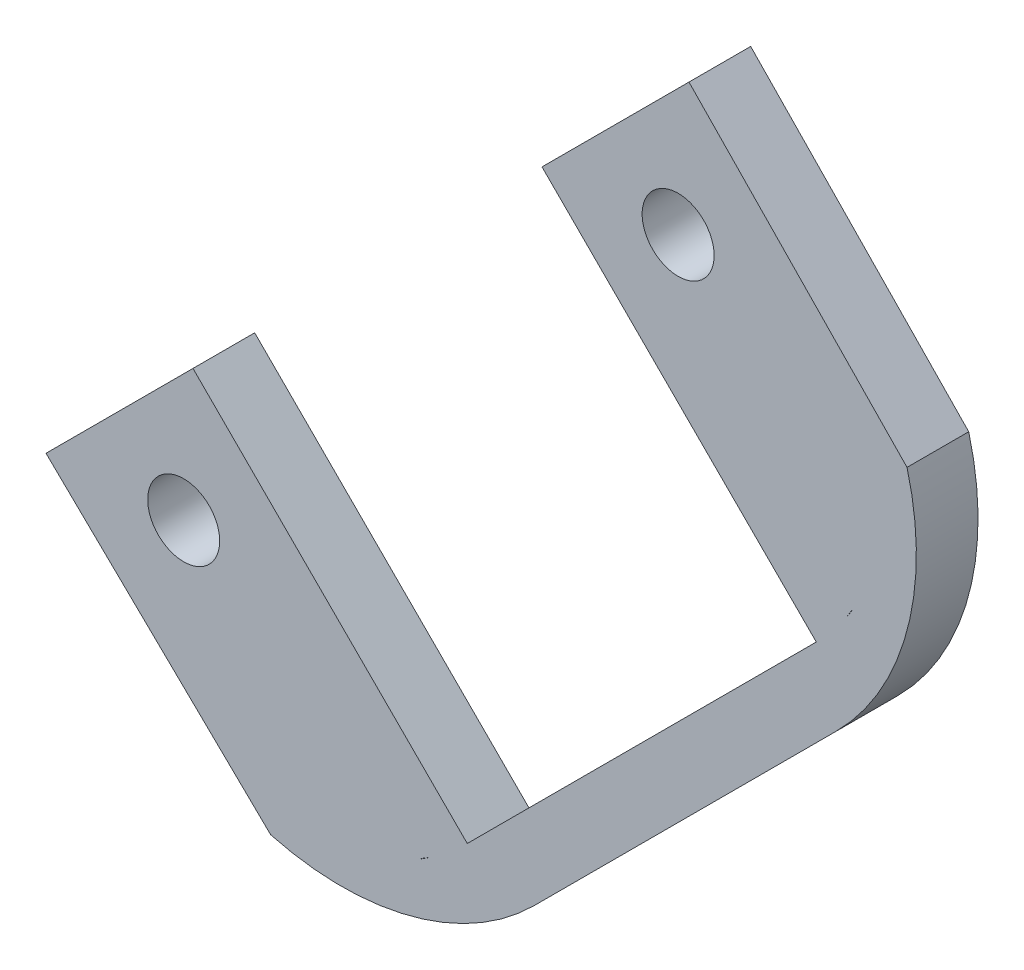
ISO-10303-21;
HEADER;
FILE_DESCRIPTION(('STEP AP214'),'2;1');
FILE_NAME('part.step','',(''),(''),'','','');
FILE_SCHEMA(('AUTOMOTIVE_DESIGN { 1 0 10303 214 1 1 1 1 }'));
ENDSEC;
DATA;
#1=APPLICATION_CONTEXT('core data for automotive mechanical design processes');
#2=APPLICATION_PROTOCOL_DEFINITION('international standard','automotive_design',2000,#1);
#3=PRODUCT_CONTEXT('',#1,'mechanical');
#4=PRODUCT('Part','Part','',(#3));
#5=PRODUCT_RELATED_PRODUCT_CATEGORY('part','',(#4));
#6=PRODUCT_DEFINITION_FORMATION('','',#4);
#7=PRODUCT_DEFINITION_CONTEXT('part definition',#1,'design');
#8=PRODUCT_DEFINITION('design','',#6,#7);
#9=PRODUCT_DEFINITION_SHAPE('','',#8);
#10=(LENGTH_UNIT() NAMED_UNIT(*) SI_UNIT(.MILLI.,.METRE.));
#11=(NAMED_UNIT(*) PLANE_ANGLE_UNIT() SI_UNIT($,.RADIAN.));
#12=(NAMED_UNIT(*) SI_UNIT($,.STERADIAN.) SOLID_ANGLE_UNIT());
#13=UNCERTAINTY_MEASURE_WITH_UNIT(LENGTH_MEASURE(1.E-05),#10,'distance_accuracy_value','');
#14=(GEOMETRIC_REPRESENTATION_CONTEXT(3) GLOBAL_UNCERTAINTY_ASSIGNED_CONTEXT((#13)) GLOBAL_UNIT_ASSIGNED_CONTEXT((#10,
#11,#12)) REPRESENTATION_CONTEXT('',''));
#15=CARTESIAN_POINT('',(0.,0.,0.));
#16=DIRECTION('',(0.,0.,1.));
#17=DIRECTION('',(1.,0.,0.));
#18=AXIS2_PLACEMENT_3D('',#15,#16,#17);
#19=CARTESIAN_POINT('',(8.48528137423825,8.48528137423825,3.));
#20=DIRECTION('',(-0.707106781186547,-0.707106781186548,0.));
#21=DIRECTION('',(0.707106781186548,-0.707106781186547,0.));
#22=AXIS2_PLACEMENT_3D('',#19,#20,#21);
#23=PLANE('',#22);
#24=DIRECTION('',(-0.707106781186548,0.707106781186547,0.));
#25=VECTOR('',#24,1.);
#26=CARTESIAN_POINT('',(8.48528137423825,8.48528137423825,3.));
#27=LINE('',#26,#25);
#28=CARTESIAN_POINT('',(-44.5477272147514,61.5182899632279,3.));
#29=VERTEX_POINT('',#28);
#30=CARTESIAN_POINT('',(-57.8849131188985,74.855475867375,3.));
#31=VERTEX_POINT('',#30);
#32=EDGE_CURVE('E226',#29,#31,#27,.T.);
#33=ORIENTED_EDGE('',*,*,#32,.T.);
#34=DIRECTION('',(0.,0.,-1.));
#35=VECTOR('',#34,1.);
#36=CARTESIAN_POINT('',(-57.8849131188985,74.855475867375,3.));
#37=LINE('',#36,#35);
#38=CARTESIAN_POINT('',(-57.8849131188985,74.855475867375,0.));
#39=VERTEX_POINT('',#38);
#40=EDGE_CURVE('E204',#31,#39,#37,.T.);
#41=ORIENTED_EDGE('',*,*,#40,.T.);
#42=DIRECTION('',(-0.707106781186548,0.707106781186547,0.));
#43=VECTOR('',#42,1.);
#44=CARTESIAN_POINT('',(8.48528137423825,8.48528137423825,0.));
#45=LINE('',#44,#43);
#46=CARTESIAN_POINT('',(-44.5477272147514,61.5182899632279,0.));
#47=VERTEX_POINT('',#46);
#48=EDGE_CURVE('E259',#47,#39,#45,.T.);
#49=ORIENTED_EDGE('',*,*,#48,.F.);
#50=DIRECTION('',(0.,0.,-1.));
#51=VECTOR('',#50,1.);
#52=CARTESIAN_POINT('',(-44.5477272147514,61.5182899632279,3.));
#53=LINE('',#52,#51);
#54=EDGE_CURVE('E286',#29,#47,#53,.T.);
#55=ORIENTED_EDGE('',*,*,#54,.F.);
#56=EDGE_LOOP('',(#33,#41,#49,#55));
#57=FACE_BOUND('',#56,.T.);
#58=ADVANCED_FACE('F77',(#57),#23,.T.);
#59=CARTESIAN_POINT('',(-67.6375507112246,52.9508824085547,3.));
#60=DIRECTION('',(0.,0.,-1.));
#61=DIRECTION('',(-1.,0.,0.));
#62=AXIS2_PLACEMENT_3D('',#59,#60,#61);
#63=CYLINDRICAL_SURFACE('',#62,13.2688987916568);
#64=CARTESIAN_POINT('',(-67.6375507112246,52.9508824085547,3.));
#65=DIRECTION('',(0.,0.,1.));
#66=DIRECTION('',(1.,0.,0.));
#67=AXIS2_PLACEMENT_3D('',#64,#65,#66);
#68=CIRCLE('',#67,13.2688987916568);
#69=CARTESIAN_POINT('',(-58.2550223967661,43.5683540940962,3.));
#70=VERTEX_POINT('',#69);
#71=CARTESIAN_POINT('',(-71.0779259033398,40.1357548758023,3.));
#72=VERTEX_POINT('',#71);
#73=EDGE_CURVE('E234',#70,#72,#68,.F.);
#74=ORIENTED_EDGE('',*,*,#73,.T.);
#75=DIRECTION('',(0.,0.,1.));
#76=VECTOR('',#75,1.);
#77=CARTESIAN_POINT('',(-71.0779259033398,40.1357548758023,0.));
#78=LINE('',#77,#76);
#79=CARTESIAN_POINT('',(-71.0779259033398,40.1357548758023,0.));
#80=VERTEX_POINT('',#79);
#81=EDGE_CURVE('E197',#80,#72,#78,.T.);
#82=ORIENTED_EDGE('',*,*,#81,.F.);
#83=CARTESIAN_POINT('',(-67.6375507112246,52.9508824085547,0.));
#84=DIRECTION('',(0.,0.,1.));
#85=DIRECTION('',(1.,0.,0.));
#86=AXIS2_PLACEMENT_3D('',#83,#84,#85);
#87=CIRCLE('',#86,13.2688987916568);
#88=CARTESIAN_POINT('',(-58.2550223967661,43.5683540940962,0.));
#89=VERTEX_POINT('',#88);
#90=EDGE_CURVE('E196',#89,#80,#87,.F.);
#91=ORIENTED_EDGE('',*,*,#90,.F.);
#92=DIRECTION('',(0.,0.,-1.));
#93=VECTOR('',#92,1.);
#94=CARTESIAN_POINT('',(-58.2550223967661,43.5683540940962,3.));
#95=LINE('',#94,#93);
#96=EDGE_CURVE('E281',#70,#89,#95,.T.);
#97=ORIENTED_EDGE('',*,*,#96,.F.);
#98=EDGE_LOOP('',(#74,#82,#91,#97));
#99=FACE_BOUND('',#98,.T.);
#100=ADVANCED_FACE('F324',(#99),#63,.T.);
#101=CARTESIAN_POINT('',(0.,0.,3.));
#102=DIRECTION('',(0.,0.,1.));
#103=DIRECTION('',(1.,0.,0.));
#104=AXIS2_PLACEMENT_3D('',#101,#102,#103);
#105=PLANE('',#104);
#106=CARTESIAN_POINT('',(-40.0316131143859,61.7917633764762,3.));
#107=DIRECTION('',(0.,0.,1.));
#108=DIRECTION('',(1.,0.,0.));
#109=AXIS2_PLACEMENT_3D('',#106,#107,#108);
#110=CIRCLE('',#109,3.38674980996248);
#111=CARTESIAN_POINT('',(-43.0211581293099,63.3832076510345,3.));
#112=VERTEX_POINT('',#111);
#113=CARTESIAN_POINT('',(-42.7452083028537,63.8182074118261,3.));
#114=VERTEX_POINT('',#113);
#115=EDGE_CURVE('E214',#112,#114,#110,.F.);
#116=ORIENTED_EDGE('',*,*,#115,.T.);
#117=CARTESIAN_POINT('',(-53.1310804698243,70.1016432183008,3.));
#118=DIRECTION('',(0.,0.,1.));
#119=DIRECTION('',(1.,0.,0.));
#120=AXIS2_PLACEMENT_3D('',#117,#118,#119);
#121=CIRCLE('',#120,12.1386945839634);
#122=EDGE_CURVE('E217',#114,#112,#121,.F.);
#123=ORIENTED_EDGE('',*,*,#122,.T.);
#124=EDGE_LOOP('',(#116,#123));
#125=FACE_BOUND('',#124,.T.);
#126=CARTESIAN_POINT('',(-61.7917633764768,40.0316131143856,3.));
#127=DIRECTION('',(0.,0.,1.));
#128=DIRECTION('',(1.,0.,0.));
#129=AXIS2_PLACEMENT_3D('',#126,#127,#128);
#130=CIRCLE('',#129,3.38674980996217);
#131=CARTESIAN_POINT('',(-63.3832076510358,43.0211581293087,3.));
#132=VERTEX_POINT('',#131);
#133=CARTESIAN_POINT('',(-63.8182074118257,42.7452083028537,3.));
#134=VERTEX_POINT('',#133);
#135=EDGE_CURVE('E237',#132,#134,#130,.T.);
#136=ORIENTED_EDGE('',*,*,#135,.F.);
#137=CARTESIAN_POINT('',(-70.1016432183015,53.1310804698237,3.));
#138=DIRECTION('',(0.,0.,1.));
#139=DIRECTION('',(1.,0.,0.));
#140=AXIS2_PLACEMENT_3D('',#137,#138,#139);
#141=CIRCLE('',#140,12.1386945839634);
#142=EDGE_CURVE('E240',#132,#134,#141,.F.);
#143=ORIENTED_EDGE('',*,*,#142,.T.);
#144=EDGE_LOOP('',(#136,#143));
#145=FACE_BOUND('',#144,.T.);
#146=CARTESIAN_POINT('',(-75.3068721963662,51.2652416360229,3.));
#147=DIRECTION('',(0.,0.,1.));
#148=DIRECTION('',(1.,0.,0.));
#149=AXIS2_PLACEMENT_3D('',#146,#147,#148);
#150=CIRCLE('',#149,1.75);
#151=CARTESIAN_POINT('',(-73.5568721963662,51.2652416360229,3.));
#152=VERTEX_POINT('',#151);
#153=EDGE_CURVE('E242',#152,#152,#150,.T.);
#154=ORIENTED_EDGE('',*,*,#153,.F.);
#155=EDGE_LOOP('',(#154));
#156=FACE_BOUND('',#155,.T.);
#157=CARTESIAN_POINT('',(-51.2652416360236,75.3068721963655,3.));
#158=DIRECTION('',(0.,0.,1.));
#159=DIRECTION('',(1.,0.,0.));
#160=AXIS2_PLACEMENT_3D('',#157,#158,#159);
#161=CIRCLE('',#160,1.75000000000379);
#162=CARTESIAN_POINT('',(-49.5152416360198,75.3068721963655,3.));
#163=VERTEX_POINT('',#162);
#164=EDGE_CURVE('E245',#163,#163,#161,.T.);
#165=ORIENTED_EDGE('',*,*,#164,.F.);
#166=EDGE_LOOP('',(#165));
#167=FACE_BOUND('',#166,.T.);
#168=DIRECTION('',(0.707106781186546,0.707106781186549,0.));
#169=VECTOR('',#168,1.);
#170=CARTESIAN_POINT('',(-66.3701944931369,66.3701944931367,3.));
#171=LINE('',#170,#169);
#172=CARTESIAN_POINT('',(-82.0021553932792,50.7382335929944,3.));
#173=VERTEX_POINT('',#172);
#174=CARTESIAN_POINT('',(-74.8554758673756,57.8849131188978,3.));
#175=VERTEX_POINT('',#174);
#176=EDGE_CURVE('E200',#173,#175,#171,.T.);
#177=ORIENTED_EDGE('',*,*,#176,.F.);
#178=DIRECTION('',(0.71759546167396,-0.696460159223007,0.));
#179=VECTOR('',#178,1.);
#180=CARTESIAN_POINT('',(-14.4179148792218,-14.8554517399439,3.));
#181=LINE('',#180,#179);
#182=EDGE_CURVE('E186',#173,#72,#181,.T.);
#183=ORIENTED_EDGE('',*,*,#182,.T.);
#184=ORIENTED_EDGE('',*,*,#73,.F.);
#185=DIRECTION('',(0.707106781186548,0.707106781186548,0.));
#186=VECTOR('',#185,1.);
#187=CARTESIAN_POINT('',(-50.9116882454312,50.9116882454312,3.));
#188=LINE('',#187,#186);
#189=CARTESIAN_POINT('',(-43.5683540940967,58.2550223967656,3.));
#190=VERTEX_POINT('',#189);
#191=EDGE_CURVE('E220',#70,#190,#188,.T.);
#192=ORIENTED_EDGE('',*,*,#191,.T.);
#193=CARTESIAN_POINT('',(-52.9508824085551,67.637550711224,3.));
#194=DIRECTION('',(0.,0.,1.));
#195=DIRECTION('',(1.,0.,0.));
#196=AXIS2_PLACEMENT_3D('',#193,#194,#195);
#197=CIRCLE('',#196,13.2688987916567);
#198=CARTESIAN_POINT('',(-40.1357548758028,71.077925903339,3.));
#199=VERTEX_POINT('',#198);
#200=EDGE_CURVE('E223',#190,#199,#197,.T.);
#201=ORIENTED_EDGE('',*,*,#200,.T.);
#202=DIRECTION('',(0.696460159223008,-0.717595461673959,0.));
#203=VECTOR('',#202,1.);
#204=CARTESIAN_POINT('',(14.8554517399433,14.4179148792213,3.));
#205=LINE('',#204,#203);
#206=CARTESIAN_POINT('',(-50.7382335929951,82.0021553932785,3.));
#207=VERTEX_POINT('',#206);
#208=EDGE_CURVE('E209',#207,#199,#205,.T.);
#209=ORIENTED_EDGE('',*,*,#208,.F.);
#210=DIRECTION('',(-0.707106781186548,-0.707106781186547,0.));
#211=VECTOR('',#210,1.);
#212=CARTESIAN_POINT('',(-66.3701944931367,66.3701944931368,3.));
#213=LINE('',#212,#211);
#214=EDGE_CURVE('E358',#207,#31,#213,.T.);
#215=ORIENTED_EDGE('',*,*,#214,.T.);
#216=ORIENTED_EDGE('',*,*,#32,.F.);
#217=DIRECTION('',(0.707106781186547,0.707106781186548,0.));
#218=VECTOR('',#217,1.);
#219=CARTESIAN_POINT('',(-53.0330085889896,53.0330085889896,3.));
#220=LINE('',#219,#218);
#221=CARTESIAN_POINT('',(-61.5182899632285,44.5477272147507,3.));
#222=VERTEX_POINT('',#221);
#223=EDGE_CURVE('E229',#222,#29,#220,.T.);
#224=ORIENTED_EDGE('',*,*,#223,.F.);
#225=DIRECTION('',(0.707106781186548,-0.707106781186548,0.));
#226=VECTOR('',#225,1.);
#227=CARTESIAN_POINT('',(-8.4852813742389,-8.4852813742389,3.));
#228=LINE('',#227,#226);
#229=EDGE_CURVE('E232',#175,#222,#228,.T.);
#230=ORIENTED_EDGE('',*,*,#229,.F.);
#231=EDGE_LOOP('',(#177,#183,#184,#192,#201,#209,#215,#216,#224,#230));
#232=FACE_BOUND('',#231,.T.);
#233=ADVANCED_FACE('F302',(#125,#145,#156,#167,#232),#105,.T.);
#234=CARTESIAN_POINT('',(0.,0.,0.));
#235=DIRECTION('',(0.,0.,1.));
#236=DIRECTION('',(1.,0.,0.));
#237=AXIS2_PLACEMENT_3D('',#234,#235,#236);
#238=PLANE('',#237);
#239=CARTESIAN_POINT('',(-40.0316131143859,61.7917633764762,0.));
#240=DIRECTION('',(0.,0.,1.));
#241=DIRECTION('',(1.,0.,0.));
#242=AXIS2_PLACEMENT_3D('',#239,#240,#241);
#243=CIRCLE('',#242,3.38674980996248);
#244=CARTESIAN_POINT('',(-43.0211581293099,63.3832076510345,0.));
#245=VERTEX_POINT('',#244);
#246=CARTESIAN_POINT('',(-42.7452083028537,63.8182074118261,0.));
#247=VERTEX_POINT('',#246);
#248=EDGE_CURVE('E213',#245,#247,#243,.F.);
#249=ORIENTED_EDGE('',*,*,#248,.F.);
#250=CARTESIAN_POINT('',(-53.1310804698243,70.1016432183008,0.));
#251=DIRECTION('',(0.,0.,1.));
#252=DIRECTION('',(1.,0.,0.));
#253=AXIS2_PLACEMENT_3D('',#250,#251,#252);
#254=CIRCLE('',#253,12.1386945839634);
#255=EDGE_CURVE('E251',#247,#245,#254,.F.);
#256=ORIENTED_EDGE('',*,*,#255,.F.);
#257=EDGE_LOOP('',(#249,#256));
#258=FACE_BOUND('',#257,.T.);
#259=CARTESIAN_POINT('',(-61.7917633764768,40.0316131143856,0.));
#260=DIRECTION('',(0.,0.,1.));
#261=DIRECTION('',(1.,0.,0.));
#262=AXIS2_PLACEMENT_3D('',#259,#260,#261);
#263=CIRCLE('',#262,3.38674980996217);
#264=CARTESIAN_POINT('',(-63.3832076510358,43.0211581293087,0.));
#265=VERTEX_POINT('',#264);
#266=CARTESIAN_POINT('',(-63.8182074118257,42.7452083028537,0.));
#267=VERTEX_POINT('',#266);
#268=EDGE_CURVE('E268',#265,#267,#263,.T.);
#269=ORIENTED_EDGE('',*,*,#268,.T.);
#270=CARTESIAN_POINT('',(-70.1016432183015,53.1310804698237,0.));
#271=DIRECTION('',(0.,0.,1.));
#272=DIRECTION('',(1.,0.,0.));
#273=AXIS2_PLACEMENT_3D('',#270,#271,#272);
#274=CIRCLE('',#273,12.1386945839634);
#275=EDGE_CURVE('E271',#265,#267,#274,.F.);
#276=ORIENTED_EDGE('',*,*,#275,.F.);
#277=EDGE_LOOP('',(#269,#276));
#278=FACE_BOUND('',#277,.T.);
#279=CARTESIAN_POINT('',(-75.3068721963662,51.2652416360229,0.));
#280=DIRECTION('',(0.,0.,1.));
#281=DIRECTION('',(1.,0.,0.));
#282=AXIS2_PLACEMENT_3D('',#279,#280,#281);
#283=CIRCLE('',#282,1.75);
#284=CARTESIAN_POINT('',(-73.5568721963662,51.2652416360229,0.));
#285=VERTEX_POINT('',#284);
#286=EDGE_CURVE('E274',#285,#285,#283,.T.);
#287=ORIENTED_EDGE('',*,*,#286,.T.);
#288=EDGE_LOOP('',(#287));
#289=FACE_BOUND('',#288,.T.);
#290=CARTESIAN_POINT('',(-51.2652416360236,75.3068721963655,0.));
#291=DIRECTION('',(0.,0.,1.));
#292=DIRECTION('',(1.,0.,0.));
#293=AXIS2_PLACEMENT_3D('',#290,#291,#292);
#294=CIRCLE('',#293,1.75000000000379);
#295=CARTESIAN_POINT('',(-49.5152416360198,75.3068721963655,0.));
#296=VERTEX_POINT('',#295);
#297=EDGE_CURVE('E218',#296,#296,#294,.T.);
#298=ORIENTED_EDGE('',*,*,#297,.T.);
#299=EDGE_LOOP('',(#298));
#300=FACE_BOUND('',#299,.T.);
#301=DIRECTION('',(0.71759546167396,-0.696460159223007,0.));
#302=VECTOR('',#301,1.);
#303=CARTESIAN_POINT('',(-14.4179148792218,-14.8554517399439,0.));
#304=LINE('',#303,#302);
#305=CARTESIAN_POINT('',(-82.0021553932792,50.7382335929944,0.));
#306=VERTEX_POINT('',#305);
#307=EDGE_CURVE('E183',#306,#80,#304,.T.);
#308=ORIENTED_EDGE('',*,*,#307,.F.);
#309=DIRECTION('',(0.707106781186546,0.707106781186549,0.));
#310=VECTOR('',#309,1.);
#311=CARTESIAN_POINT('',(-66.3701944931369,66.3701944931367,0.));
#312=LINE('',#311,#310);
#313=CARTESIAN_POINT('',(-74.8554758673756,57.8849131188978,0.));
#314=VERTEX_POINT('',#313);
#315=EDGE_CURVE('E188',#306,#314,#312,.T.);
#316=ORIENTED_EDGE('',*,*,#315,.T.);
#317=DIRECTION('',(0.707106781186548,-0.707106781186548,0.));
#318=VECTOR('',#317,1.);
#319=CARTESIAN_POINT('',(-8.4852813742389,-8.4852813742389,0.));
#320=LINE('',#319,#318);
#321=CARTESIAN_POINT('',(-61.5182899632285,44.5477272147507,0.));
#322=VERTEX_POINT('',#321);
#323=EDGE_CURVE('E265',#314,#322,#320,.T.);
#324=ORIENTED_EDGE('',*,*,#323,.T.);
#325=DIRECTION('',(0.707106781186547,0.707106781186548,0.));
#326=VECTOR('',#325,1.);
#327=CARTESIAN_POINT('',(-53.0330085889896,53.0330085889896,0.));
#328=LINE('',#327,#326);
#329=EDGE_CURVE('E262',#322,#47,#328,.T.);
#330=ORIENTED_EDGE('',*,*,#329,.T.);
#331=ORIENTED_EDGE('',*,*,#48,.T.);
#332=DIRECTION('',(-0.707106781186548,-0.707106781186547,0.));
#333=VECTOR('',#332,1.);
#334=CARTESIAN_POINT('',(-66.3701944931367,66.3701944931368,0.));
#335=LINE('',#334,#333);
#336=CARTESIAN_POINT('',(-50.7382335929951,82.0021553932785,0.));
#337=VERTEX_POINT('',#336);
#338=EDGE_CURVE('E355',#337,#39,#335,.T.);
#339=ORIENTED_EDGE('',*,*,#338,.F.);
#340=DIRECTION('',(0.696460159223008,-0.717595461673959,0.));
#341=VECTOR('',#340,1.);
#342=CARTESIAN_POINT('',(14.8554517399433,14.4179148792213,0.));
#343=LINE('',#342,#341);
#344=CARTESIAN_POINT('',(-40.1357548758028,71.0779259033389,0.));
#345=VERTEX_POINT('',#344);
#346=EDGE_CURVE('E207',#337,#345,#343,.T.);
#347=ORIENTED_EDGE('',*,*,#346,.T.);
#348=CARTESIAN_POINT('',(-52.9508824085551,67.637550711224,0.));
#349=DIRECTION('',(0.,0.,1.));
#350=DIRECTION('',(1.,0.,0.));
#351=AXIS2_PLACEMENT_3D('',#348,#349,#350);
#352=CIRCLE('',#351,13.2688987916567);
#353=CARTESIAN_POINT('',(-43.5683540940967,58.2550223967656,0.));
#354=VERTEX_POINT('',#353);
#355=EDGE_CURVE('E256',#354,#345,#352,.T.);
#356=ORIENTED_EDGE('',*,*,#355,.F.);
#357=DIRECTION('',(0.707106781186548,0.707106781186548,0.));
#358=VECTOR('',#357,1.);
#359=CARTESIAN_POINT('',(-50.9116882454312,50.9116882454312,0.));
#360=LINE('',#359,#358);
#361=EDGE_CURVE('E253',#89,#354,#360,.T.);
#362=ORIENTED_EDGE('',*,*,#361,.F.);
#363=ORIENTED_EDGE('',*,*,#90,.T.);
#364=EDGE_LOOP('',(#308,#316,#324,#330,#331,#339,#347,#356,#362,#363));
#365=FACE_BOUND('',#364,.T.);
#366=ADVANCED_FACE('F192',(#258,#278,#289,#300,#365),#238,.F.);
#367=CARTESIAN_POINT('',(-61.7917633764768,40.0316131143856,3.));
#368=DIRECTION('',(0.,0.,-1.));
#369=DIRECTION('',(-1.,0.,0.));
#370=AXIS2_PLACEMENT_3D('',#367,#368,#369);
#371=CYLINDRICAL_SURFACE('',#370,3.38674980996217);
#372=ORIENTED_EDGE('',*,*,#268,.F.);
#373=DIRECTION('',(0.,0.,-1.));
#374=VECTOR('',#373,1.);
#375=CARTESIAN_POINT('',(-63.3832076510358,43.0211581293087,3.));
#376=LINE('',#375,#374);
#377=EDGE_CURVE('E12',#132,#265,#376,.T.);
#378=ORIENTED_EDGE('',*,*,#377,.F.);
#379=ORIENTED_EDGE('',*,*,#135,.T.);
#380=DIRECTION('',(0.,0.,-1.));
#381=VECTOR('',#380,1.);
#382=CARTESIAN_POINT('',(-63.8182074118257,42.7452083028537,3.));
#383=LINE('',#382,#381);
#384=EDGE_CURVE('E86',#134,#267,#383,.T.);
#385=ORIENTED_EDGE('',*,*,#384,.T.);
#386=EDGE_LOOP('',(#372,#378,#379,#385));
#387=FACE_BOUND('',#386,.T.);
#388=ADVANCED_FACE('F301',(#387),#371,.F.);
#389=CARTESIAN_POINT('',(-50.9116882454312,50.9116882454312,3.));
#390=DIRECTION('',(-0.707106781186547,0.707106781186547,0.));
#391=DIRECTION('',(-0.707106781186548,-0.707106781186548,0.));
#392=AXIS2_PLACEMENT_3D('',#389,#390,#391);
#393=PLANE('',#392);
#394=ORIENTED_EDGE('',*,*,#361,.T.);
#395=DIRECTION('',(0.,0.,-1.));
#396=VECTOR('',#395,1.);
#397=CARTESIAN_POINT('',(-43.5683540940967,58.2550223967656,3.));
#398=LINE('',#397,#396);
#399=EDGE_CURVE('E279',#190,#354,#398,.T.);
#400=ORIENTED_EDGE('',*,*,#399,.F.);
#401=ORIENTED_EDGE('',*,*,#191,.F.);
#402=ORIENTED_EDGE('',*,*,#96,.T.);
#403=EDGE_LOOP('',(#394,#400,#401,#402));
#404=FACE_BOUND('',#403,.T.);
#405=ADVANCED_FACE('F339',(#404),#393,.F.);
#406=CARTESIAN_POINT('',(-52.9508824085551,67.637550711224,3.));
#407=DIRECTION('',(0.,0.,-1.));
#408=DIRECTION('',(-1.,0.,0.));
#409=AXIS2_PLACEMENT_3D('',#406,#407,#408);
#410=CYLINDRICAL_SURFACE('',#409,13.2688987916567);
#411=ORIENTED_EDGE('',*,*,#355,.T.);
#412=DIRECTION('',(0.,0.,1.));
#413=VECTOR('',#412,1.);
#414=CARTESIAN_POINT('',(-40.1357548758028,71.077925903339,0.));
#415=LINE('',#414,#413);
#416=EDGE_CURVE('E94',#345,#199,#415,.T.);
#417=ORIENTED_EDGE('',*,*,#416,.T.);
#418=ORIENTED_EDGE('',*,*,#200,.F.);
#419=ORIENTED_EDGE('',*,*,#399,.T.);
#420=EDGE_LOOP('',(#411,#417,#418,#419));
#421=FACE_BOUND('',#420,.T.);
#422=ADVANCED_FACE('F336',(#421),#410,.T.);
#423=CARTESIAN_POINT('',(-53.0330085889896,53.0330085889896,3.));
#424=DIRECTION('',(-0.707106781186548,0.707106781186547,0.));
#425=DIRECTION('',(-0.707106781186547,-0.707106781186548,0.));
#426=AXIS2_PLACEMENT_3D('',#423,#424,#425);
#427=PLANE('',#426);
#428=ORIENTED_EDGE('',*,*,#329,.F.);
#429=DIRECTION('',(0.,0.,-1.));
#430=VECTOR('',#429,1.);
#431=CARTESIAN_POINT('',(-61.5182899632285,44.5477272147507,3.));
#432=LINE('',#431,#430);
#433=EDGE_CURVE('E283',#222,#322,#432,.T.);
#434=ORIENTED_EDGE('',*,*,#433,.F.);
#435=ORIENTED_EDGE('',*,*,#223,.T.);
#436=ORIENTED_EDGE('',*,*,#54,.T.);
#437=EDGE_LOOP('',(#428,#434,#435,#436));
#438=FACE_BOUND('',#437,.T.);
#439=ADVANCED_FACE('F334',(#438),#427,.T.);
#440=CARTESIAN_POINT('',(-8.4852813742389,-8.4852813742389,3.));
#441=DIRECTION('',(0.707106781186547,0.707106781186547,0.));
#442=DIRECTION('',(-0.707106781186548,0.707106781186548,0.));
#443=AXIS2_PLACEMENT_3D('',#440,#441,#442);
#444=PLANE('',#443);
#445=DIRECTION('',(0.,0.,-1.));
#446=VECTOR('',#445,1.);
#447=CARTESIAN_POINT('',(-74.8554758673756,57.8849131188978,3.));
#448=LINE('',#447,#446);
#449=EDGE_CURVE('E102',#175,#314,#448,.T.);
#450=ORIENTED_EDGE('',*,*,#449,.F.);
#451=ORIENTED_EDGE('',*,*,#229,.T.);
#452=ORIENTED_EDGE('',*,*,#433,.T.);
#453=ORIENTED_EDGE('',*,*,#323,.F.);
#454=EDGE_LOOP('',(#450,#451,#452,#453));
#455=FACE_BOUND('',#454,.T.);
#456=ADVANCED_FACE('F366',(#455),#444,.T.);
#457=CARTESIAN_POINT('',(-40.0316131143859,61.7917633764762,3.));
#458=DIRECTION('',(0.,0.,-1.));
#459=DIRECTION('',(-1.,0.,0.));
#460=AXIS2_PLACEMENT_3D('',#457,#458,#459);
#461=CYLINDRICAL_SURFACE('',#460,3.38674980996248);
#462=ORIENTED_EDGE('',*,*,#248,.T.);
#463=DIRECTION('',(0.,0.,-1.));
#464=VECTOR('',#463,1.);
#465=CARTESIAN_POINT('',(-42.7452083028537,63.8182074118261,3.));
#466=LINE('',#465,#464);
#467=EDGE_CURVE('E81',#114,#247,#466,.T.);
#468=ORIENTED_EDGE('',*,*,#467,.F.);
#469=ORIENTED_EDGE('',*,*,#115,.F.);
#470=DIRECTION('',(0.,0.,-1.));
#471=VECTOR('',#470,1.);
#472=CARTESIAN_POINT('',(-43.0211581293099,63.3832076510345,3.));
#473=LINE('',#472,#471);
#474=EDGE_CURVE('E248',#112,#245,#473,.T.);
#475=ORIENTED_EDGE('',*,*,#474,.T.);
#476=EDGE_LOOP('',(#462,#468,#469,#475));
#477=FACE_BOUND('',#476,.T.);
#478=ADVANCED_FACE('F79',(#477),#461,.F.);
#479=CARTESIAN_POINT('',(-75.3068721963662,51.2652416360229,3.));
#480=DIRECTION('',(0.,0.,-1.));
#481=DIRECTION('',(-1.,0.,0.));
#482=AXIS2_PLACEMENT_3D('',#479,#480,#481);
#483=CYLINDRICAL_SURFACE('',#482,1.75);
#484=ORIENTED_EDGE('',*,*,#153,.T.);
#485=EDGE_LOOP('',(#484));
#486=FACE_BOUND('',#485,.T.);
#487=ORIENTED_EDGE('',*,*,#286,.F.);
#488=EDGE_LOOP('',(#487));
#489=FACE_BOUND('',#488,.T.);
#490=ADVANCED_FACE('F395',(#486,#489),#483,.F.);
#491=CARTESIAN_POINT('',(-70.1016432183015,53.1310804698237,3.));
#492=DIRECTION('',(0.,0.,-1.));
#493=DIRECTION('',(-1.,0.,0.));
#494=AXIS2_PLACEMENT_3D('',#491,#492,#493);
#495=CYLINDRICAL_SURFACE('',#494,12.1386945839634);
#496=ORIENTED_EDGE('',*,*,#275,.T.);
#497=ORIENTED_EDGE('',*,*,#384,.F.);
#498=ORIENTED_EDGE('',*,*,#142,.F.);
#499=ORIENTED_EDGE('',*,*,#377,.T.);
#500=EDGE_LOOP('',(#496,#497,#498,#499));
#501=FACE_BOUND('',#500,.T.);
#502=ADVANCED_FACE('F321',(#501),#495,.F.);
#503=CARTESIAN_POINT('',(-53.1310804698243,70.1016432183008,3.));
#504=DIRECTION('',(0.,0.,-1.));
#505=DIRECTION('',(-1.,0.,0.));
#506=AXIS2_PLACEMENT_3D('',#503,#504,#505);
#507=CYLINDRICAL_SURFACE('',#506,12.1386945839634);
#508=ORIENTED_EDGE('',*,*,#255,.T.);
#509=ORIENTED_EDGE('',*,*,#474,.F.);
#510=ORIENTED_EDGE('',*,*,#122,.F.);
#511=ORIENTED_EDGE('',*,*,#467,.T.);
#512=EDGE_LOOP('',(#508,#509,#510,#511));
#513=FACE_BOUND('',#512,.T.);
#514=ADVANCED_FACE('F297',(#513),#507,.F.);
#515=CARTESIAN_POINT('',(-51.2652416360236,75.3068721963655,3.));
#516=DIRECTION('',(0.,0.,-1.));
#517=DIRECTION('',(-1.,0.,0.));
#518=AXIS2_PLACEMENT_3D('',#515,#516,#517);
#519=CYLINDRICAL_SURFACE('',#518,1.75000000000379);
#520=ORIENTED_EDGE('',*,*,#164,.T.);
#521=EDGE_LOOP('',(#520));
#522=FACE_BOUND('',#521,.T.);
#523=ORIENTED_EDGE('',*,*,#297,.F.);
#524=EDGE_LOOP('',(#523));
#525=FACE_BOUND('',#524,.T.);
#526=ADVANCED_FACE('F311',(#522,#525),#519,.F.);
#527=CARTESIAN_POINT('',(14.8554517399433,14.4179148792213,0.));
#528=DIRECTION('',(-0.717595461673959,-0.696460159223008,0.));
#529=DIRECTION('',(0.696460159223008,-0.717595461673959,0.));
#530=AXIS2_PLACEMENT_3D('',#527,#528,#529);
#531=PLANE('',#530);
#532=ORIENTED_EDGE('',*,*,#208,.T.);
#533=ORIENTED_EDGE('',*,*,#416,.F.);
#534=ORIENTED_EDGE('',*,*,#346,.F.);
#535=DIRECTION('',(0.,0.,1.));
#536=VECTOR('',#535,1.);
#537=CARTESIAN_POINT('',(-50.7382335929951,82.0021553932785,0.));
#538=LINE('',#537,#536);
#539=EDGE_CURVE('E357',#337,#207,#538,.T.);
#540=ORIENTED_EDGE('',*,*,#539,.T.);
#541=EDGE_LOOP('',(#532,#533,#534,#540));
#542=FACE_BOUND('',#541,.T.);
#543=ADVANCED_FACE('F313',(#542),#531,.F.);
#544=CARTESIAN_POINT('',(-66.3701944931369,66.3701944931367,0.));
#545=DIRECTION('',(0.707106781186549,-0.707106781186546,0.));
#546=DIRECTION('',(0.707106781186546,0.707106781186549,0.));
#547=AXIS2_PLACEMENT_3D('',#544,#545,#546);
#548=PLANE('',#547);
#549=ORIENTED_EDGE('',*,*,#449,.T.);
#550=ORIENTED_EDGE('',*,*,#315,.F.);
#551=DIRECTION('',(0.,0.,1.));
#552=VECTOR('',#551,1.);
#553=CARTESIAN_POINT('',(-82.0021553932792,50.7382335929944,0.));
#554=LINE('',#553,#552);
#555=EDGE_CURVE('E180',#306,#173,#554,.T.);
#556=ORIENTED_EDGE('',*,*,#555,.T.);
#557=ORIENTED_EDGE('',*,*,#176,.T.);
#558=EDGE_LOOP('',(#549,#550,#556,#557));
#559=FACE_BOUND('',#558,.T.);
#560=ADVANCED_FACE('F199',(#559),#548,.F.);
#561=CARTESIAN_POINT('',(-14.4179148792218,-14.8554517399439,0.));
#562=DIRECTION('',(-0.696460159223007,-0.71759546167396,0.));
#563=DIRECTION('',(0.71759546167396,-0.696460159223007,0.));
#564=AXIS2_PLACEMENT_3D('',#561,#562,#563);
#565=PLANE('',#564);
#566=ORIENTED_EDGE('',*,*,#182,.F.);
#567=ORIENTED_EDGE('',*,*,#555,.F.);
#568=ORIENTED_EDGE('',*,*,#307,.T.);
#569=ORIENTED_EDGE('',*,*,#81,.T.);
#570=EDGE_LOOP('',(#566,#567,#568,#569));
#571=FACE_BOUND('',#570,.T.);
#572=ADVANCED_FACE('F182',(#571),#565,.T.);
#573=CARTESIAN_POINT('',(-66.3701944931367,66.3701944931368,0.));
#574=DIRECTION('',(-0.707106781186547,0.707106781186548,0.));
#575=DIRECTION('',(-0.707106781186548,-0.707106781186547,0.));
#576=AXIS2_PLACEMENT_3D('',#573,#574,#575);
#577=PLANE('',#576);
#578=ORIENTED_EDGE('',*,*,#214,.F.);
#579=ORIENTED_EDGE('',*,*,#539,.F.);
#580=ORIENTED_EDGE('',*,*,#338,.T.);
#581=ORIENTED_EDGE('',*,*,#40,.F.);
#582=EDGE_LOOP('',(#578,#579,#580,#581));
#583=FACE_BOUND('',#582,.T.);
#584=ADVANCED_FACE('F374',(#583),#577,.T.);
#585=CLOSED_SHELL('',(#58,#100,#233,#366,#388,#405,#422,#439,#456,#478,#490,#502,#514,#526,#543,
#560,#572,#584));
#586=MANIFOLD_SOLID_BREP('B2',#585);
#587=ADVANCED_BREP_SHAPE_REPRESENTATION('',(#18,#586),#14);
#588=SHAPE_DEFINITION_REPRESENTATION(#9,#587);
ENDSEC;
END-ISO-10303-21;
